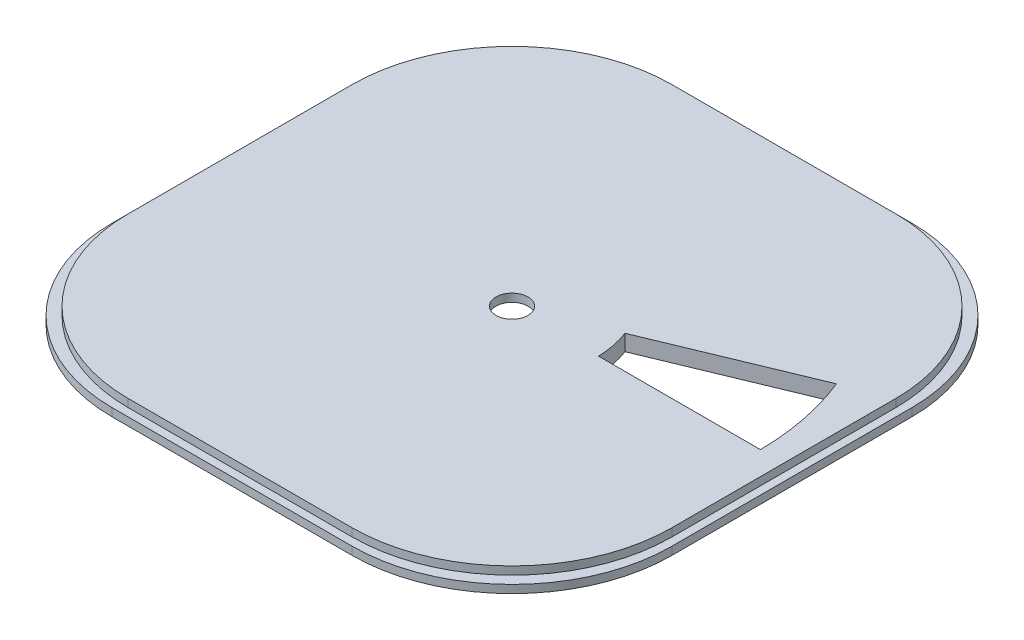
ISO-10303-21;
HEADER;
FILE_DESCRIPTION(('STEP AP214'),'2;1');
FILE_NAME('part.step','',(''),(''),'','','');
FILE_SCHEMA(('AUTOMOTIVE_DESIGN { 1 0 10303 214 1 1 1 1 }'));
ENDSEC;
DATA;
#1=APPLICATION_CONTEXT('core data for automotive mechanical design processes');
#2=APPLICATION_PROTOCOL_DEFINITION('international standard','automotive_design',2000,#1);
#3=PRODUCT_CONTEXT('',#1,'mechanical');
#4=PRODUCT('Part','Part','',(#3));
#5=PRODUCT_RELATED_PRODUCT_CATEGORY('part','',(#4));
#6=PRODUCT_DEFINITION_FORMATION('','',#4);
#7=PRODUCT_DEFINITION_CONTEXT('part definition',#1,'design');
#8=PRODUCT_DEFINITION('design','',#6,#7);
#9=PRODUCT_DEFINITION_SHAPE('','',#8);
#10=(LENGTH_UNIT() NAMED_UNIT(*) SI_UNIT(.MILLI.,.METRE.));
#11=(NAMED_UNIT(*) PLANE_ANGLE_UNIT() SI_UNIT($,.RADIAN.));
#12=(NAMED_UNIT(*) SI_UNIT($,.STERADIAN.) SOLID_ANGLE_UNIT());
#13=UNCERTAINTY_MEASURE_WITH_UNIT(LENGTH_MEASURE(1.E-05),#10,'distance_accuracy_value','');
#14=(GEOMETRIC_REPRESENTATION_CONTEXT(3) GLOBAL_UNCERTAINTY_ASSIGNED_CONTEXT((#13)) GLOBAL_UNIT_ASSIGNED_CONTEXT((#10,
#11,#12)) REPRESENTATION_CONTEXT('',''));
#15=CARTESIAN_POINT('',(0.,0.,0.));
#16=DIRECTION('',(0.,0.,1.));
#17=DIRECTION('',(1.,0.,0.));
#18=AXIS2_PLACEMENT_3D('',#15,#16,#17);
#19=CARTESIAN_POINT('',(-30.,0.,30.));
#20=DIRECTION('',(0.,-1.,0.));
#21=DIRECTION('',(0.,0.,-1.));
#22=AXIS2_PLACEMENT_3D('',#19,#20,#21);
#23=PLANE('',#22);
#24=DIRECTION('',(0.,0.,1.));
#25=VECTOR('',#24,1.);
#26=CARTESIAN_POINT('',(-70.,0.,-29.9999999999997));
#27=LINE('',#26,#25);
#28=CARTESIAN_POINT('',(-70.,0.,-29.9999999999997));
#29=VERTEX_POINT('',#28);
#30=CARTESIAN_POINT('',(-70.,0.,29.9999999999997));
#31=VERTEX_POINT('',#30);
#32=EDGE_CURVE('E324',#29,#31,#27,.T.);
#33=ORIENTED_EDGE('',*,*,#32,.T.);
#34=CARTESIAN_POINT('',(-30.,0.,30.));
#35=DIRECTION('',(0.,-1.,0.));
#36=DIRECTION('',(0.,0.,-1.));
#37=AXIS2_PLACEMENT_3D('',#34,#35,#36);
#38=CIRCLE('',#37,40.);
#39=CARTESIAN_POINT('',(-29.9999999999997,0.,70.));
#40=VERTEX_POINT('',#39);
#41=EDGE_CURVE('E347',#40,#31,#38,.T.);
#42=ORIENTED_EDGE('',*,*,#41,.F.);
#43=DIRECTION('',(1.,0.,0.));
#44=VECTOR('',#43,1.);
#45=CARTESIAN_POINT('',(-29.9999999999997,0.,70.));
#46=LINE('',#45,#44);
#47=CARTESIAN_POINT('',(29.9999999999997,0.,70.));
#48=VERTEX_POINT('',#47);
#49=EDGE_CURVE('E350',#40,#48,#46,.T.);
#50=ORIENTED_EDGE('',*,*,#49,.T.);
#51=CARTESIAN_POINT('',(30.,0.,30.));
#52=DIRECTION('',(0.,1.,0.));
#53=DIRECTION('',(0.,0.,1.));
#54=AXIS2_PLACEMENT_3D('',#51,#52,#53);
#55=CIRCLE('',#54,40.);
#56=CARTESIAN_POINT('',(70.,0.,29.9999999999997));
#57=VERTEX_POINT('',#56);
#58=EDGE_CURVE('E353',#48,#57,#55,.T.);
#59=ORIENTED_EDGE('',*,*,#58,.T.);
#60=DIRECTION('',(0.,0.,1.));
#61=VECTOR('',#60,1.);
#62=CARTESIAN_POINT('',(70.,0.,-29.9999999999997));
#63=LINE('',#62,#61);
#64=CARTESIAN_POINT('',(70.,0.,-29.9999999999997));
#65=VERTEX_POINT('',#64);
#66=EDGE_CURVE('E356',#65,#57,#63,.T.);
#67=ORIENTED_EDGE('',*,*,#66,.F.);
#68=CARTESIAN_POINT('',(30.,0.,-30.));
#69=DIRECTION('',(0.,1.,0.));
#70=DIRECTION('',(0.,0.,1.));
#71=AXIS2_PLACEMENT_3D('',#68,#69,#70);
#72=CIRCLE('',#71,40.);
#73=CARTESIAN_POINT('',(29.9999999999997,0.,-70.));
#74=VERTEX_POINT('',#73);
#75=EDGE_CURVE('E359',#65,#74,#72,.T.);
#76=ORIENTED_EDGE('',*,*,#75,.T.);
#77=DIRECTION('',(1.,0.,0.));
#78=VECTOR('',#77,1.);
#79=CARTESIAN_POINT('',(-29.9999999999997,0.,-70.));
#80=LINE('',#79,#78);
#81=CARTESIAN_POINT('',(-30.,0.,-70.));
#82=VERTEX_POINT('',#81);
#83=EDGE_CURVE('E362',#82,#74,#80,.T.);
#84=ORIENTED_EDGE('',*,*,#83,.F.);
#85=CARTESIAN_POINT('',(-30.,0.,-30.));
#86=DIRECTION('',(0.,-1.,0.));
#87=DIRECTION('',(0.,0.,-1.));
#88=AXIS2_PLACEMENT_3D('',#85,#86,#87);
#89=CIRCLE('',#88,40.);
#90=EDGE_CURVE('E365',#29,#82,#89,.T.);
#91=ORIENTED_EDGE('',*,*,#90,.F.);
#92=EDGE_LOOP('',(#33,#42,#50,#59,#67,#76,#84,#91));
#93=FACE_BOUND('',#92,.T.);
#94=CARTESIAN_POINT('',(-28.,0.,28.));
#95=DIRECTION('',(0.,1.,0.));
#96=DIRECTION('',(0.,0.,1.));
#97=AXIS2_PLACEMENT_3D('',#94,#95,#96);
#98=CIRCLE('',#97,40.);
#99=CARTESIAN_POINT('',(-68.,0.,27.9999999999997));
#100=VERTEX_POINT('',#99);
#101=CARTESIAN_POINT('',(-27.9999999999997,0.,68.));
#102=VERTEX_POINT('',#101);
#103=EDGE_CURVE('E257',#100,#102,#98,.T.);
#104=ORIENTED_EDGE('',*,*,#103,.F.);
#105=DIRECTION('',(0.,0.,1.));
#106=VECTOR('',#105,1.);
#107=CARTESIAN_POINT('',(-68.,0.,-27.9999999999997));
#108=LINE('',#107,#106);
#109=CARTESIAN_POINT('',(-68.,0.,-27.9999999999997));
#110=VERTEX_POINT('',#109);
#111=EDGE_CURVE('E264',#110,#100,#108,.T.);
#112=ORIENTED_EDGE('',*,*,#111,.F.);
#113=CARTESIAN_POINT('',(-28.,0.,-28.));
#114=DIRECTION('',(0.,1.,0.));
#115=DIRECTION('',(0.,0.,-1.));
#116=AXIS2_PLACEMENT_3D('',#113,#114,#115);
#117=CIRCLE('',#116,40.);
#118=CARTESIAN_POINT('',(-28.,0.,-68.));
#119=VERTEX_POINT('',#118);
#120=EDGE_CURVE('E296',#119,#110,#117,.T.);
#121=ORIENTED_EDGE('',*,*,#120,.F.);
#122=DIRECTION('',(-1.,0.,0.));
#123=VECTOR('',#122,1.);
#124=CARTESIAN_POINT('',(-27.9999999999997,0.,-68.));
#125=LINE('',#124,#123);
#126=CARTESIAN_POINT('',(27.9999999999997,0.,-68.));
#127=VERTEX_POINT('',#126);
#128=EDGE_CURVE('E293',#127,#119,#125,.T.);
#129=ORIENTED_EDGE('',*,*,#128,.F.);
#130=CARTESIAN_POINT('',(28.,0.,-28.));
#131=DIRECTION('',(0.,1.,0.));
#132=DIRECTION('',(0.,0.,1.));
#133=AXIS2_PLACEMENT_3D('',#130,#131,#132);
#134=CIRCLE('',#133,40.);
#135=CARTESIAN_POINT('',(68.,0.,-27.9999999999997));
#136=VERTEX_POINT('',#135);
#137=EDGE_CURVE('E290',#136,#127,#134,.T.);
#138=ORIENTED_EDGE('',*,*,#137,.F.);
#139=DIRECTION('',(0.,0.,-1.));
#140=VECTOR('',#139,1.);
#141=CARTESIAN_POINT('',(68.,0.,-27.9999999999997));
#142=LINE('',#141,#140);
#143=CARTESIAN_POINT('',(68.,0.,27.9999999999997));
#144=VERTEX_POINT('',#143);
#145=EDGE_CURVE('E287',#144,#136,#142,.T.);
#146=ORIENTED_EDGE('',*,*,#145,.F.);
#147=CARTESIAN_POINT('',(28.,0.,28.));
#148=DIRECTION('',(0.,1.,0.));
#149=DIRECTION('',(0.,0.,1.));
#150=AXIS2_PLACEMENT_3D('',#147,#148,#149);
#151=CIRCLE('',#150,40.);
#152=CARTESIAN_POINT('',(27.9999999999997,0.,68.));
#153=VERTEX_POINT('',#152);
#154=EDGE_CURVE('E284',#153,#144,#151,.T.);
#155=ORIENTED_EDGE('',*,*,#154,.F.);
#156=DIRECTION('',(1.,0.,0.));
#157=VECTOR('',#156,1.);
#158=CARTESIAN_POINT('',(-27.9999999999997,0.,68.));
#159=LINE('',#158,#157);
#160=EDGE_CURVE('E281',#102,#153,#159,.T.);
#161=ORIENTED_EDGE('',*,*,#160,.F.);
#162=EDGE_LOOP('',(#104,#112,#121,#129,#138,#146,#155,#161));
#163=FACE_BOUND('',#162,.T.);
#164=ADVANCED_FACE('F34',(#93,#163),#23,.F.);
#165=CARTESIAN_POINT('',(-70.,-2.,-29.9999999999997));
#166=DIRECTION('',(-1.,0.,0.));
#167=DIRECTION('',(0.,0.,1.));
#168=AXIS2_PLACEMENT_3D('',#165,#166,#167);
#169=PLANE('',#168);
#170=DIRECTION('',(0.,-1.,0.));
#171=VECTOR('',#170,1.);
#172=CARTESIAN_POINT('',(-70.,-0.999999999999986,3.99999999999999));
#173=LINE('',#172,#171);
#174=CARTESIAN_POINT('',(-70.,-0.999999999999986,3.99999999999999));
#175=VERTEX_POINT('',#174);
#176=CARTESIAN_POINT('',(-70.,-2.,3.99999999999999));
#177=VERTEX_POINT('',#176);
#178=EDGE_CURVE('E237',#175,#177,#173,.T.);
#179=ORIENTED_EDGE('',*,*,#178,.T.);
#180=DIRECTION('',(0.,0.,1.));
#181=VECTOR('',#180,1.);
#182=CARTESIAN_POINT('',(-70.,-2.,-29.9999999999997));
#183=LINE('',#182,#181);
#184=CARTESIAN_POINT('',(-70.,-2.,29.9999999999997));
#185=VERTEX_POINT('',#184);
#186=EDGE_CURVE('E327',#177,#185,#183,.T.);
#187=ORIENTED_EDGE('',*,*,#186,.T.);
#188=DIRECTION('',(0.,1.,0.));
#189=VECTOR('',#188,1.);
#190=CARTESIAN_POINT('',(-70.,-2.,29.9999999999997));
#191=LINE('',#190,#189);
#192=EDGE_CURVE('E38',#185,#31,#191,.T.);
#193=ORIENTED_EDGE('',*,*,#192,.T.);
#194=ORIENTED_EDGE('',*,*,#32,.F.);
#195=DIRECTION('',(0.,1.,0.));
#196=VECTOR('',#195,1.);
#197=CARTESIAN_POINT('',(-70.,-2.,-29.9999999999997));
#198=LINE('',#197,#196);
#199=CARTESIAN_POINT('',(-70.,-2.,-29.9999999999997));
#200=VERTEX_POINT('',#199);
#201=EDGE_CURVE('E11',#200,#29,#198,.T.);
#202=ORIENTED_EDGE('',*,*,#201,.F.);
#203=CARTESIAN_POINT('',(-70.,-2.,-4.00000000000001));
#204=VERTEX_POINT('',#203);
#205=EDGE_CURVE('E215',#200,#204,#183,.T.);
#206=ORIENTED_EDGE('',*,*,#205,.T.);
#207=DIRECTION('',(0.,-1.,0.));
#208=VECTOR('',#207,1.);
#209=CARTESIAN_POINT('',(-70.,-0.999999999999986,-4.00000000000001));
#210=LINE('',#209,#208);
#211=CARTESIAN_POINT('',(-70.,-0.999999999999986,-4.00000000000001));
#212=VERTEX_POINT('',#211);
#213=EDGE_CURVE('E197',#212,#204,#210,.T.);
#214=ORIENTED_EDGE('',*,*,#213,.F.);
#215=DIRECTION('',(0.,0.,-1.));
#216=VECTOR('',#215,1.);
#217=CARTESIAN_POINT('',(-70.,-0.999999999999986,0.));
#218=LINE('',#217,#216);
#219=EDGE_CURVE('E203',#175,#212,#218,.T.);
#220=ORIENTED_EDGE('',*,*,#219,.F.);
#221=EDGE_LOOP('',(#179,#187,#193,#194,#202,#206,#214,#220));
#222=FACE_BOUND('',#221,.T.);
#223=ADVANCED_FACE('F36',(#222),#169,.T.);
#224=CARTESIAN_POINT('',(-30.,-2.,-30.));
#225=DIRECTION('',(0.,1.,0.));
#226=DIRECTION('',(0.,0.,1.));
#227=AXIS2_PLACEMENT_3D('',#224,#225,#226);
#228=CYLINDRICAL_SURFACE('',#227,40.);
#229=ORIENTED_EDGE('',*,*,#90,.T.);
#230=DIRECTION('',(0.,1.,0.));
#231=VECTOR('',#230,1.);
#232=CARTESIAN_POINT('',(-30.,-2.,-70.));
#233=LINE('',#232,#231);
#234=CARTESIAN_POINT('',(-30.,-2.,-70.));
#235=VERTEX_POINT('',#234);
#236=EDGE_CURVE('E43',#235,#82,#233,.T.);
#237=ORIENTED_EDGE('',*,*,#236,.F.);
#238=CARTESIAN_POINT('',(-30.,-2.,-30.));
#239=DIRECTION('',(0.,-1.,0.));
#240=DIRECTION('',(0.,0.,-1.));
#241=AXIS2_PLACEMENT_3D('',#238,#239,#240);
#242=CIRCLE('',#241,40.);
#243=EDGE_CURVE('E343',#200,#235,#242,.T.);
#244=ORIENTED_EDGE('',*,*,#243,.F.);
#245=ORIENTED_EDGE('',*,*,#201,.T.);
#246=EDGE_LOOP('',(#229,#237,#244,#245));
#247=FACE_BOUND('',#246,.T.);
#248=ADVANCED_FACE('F391',(#247),#228,.T.);
#249=CARTESIAN_POINT('',(-29.9999999999997,-2.,-70.));
#250=DIRECTION('',(0.,0.,1.));
#251=DIRECTION('',(1.,0.,0.));
#252=AXIS2_PLACEMENT_3D('',#249,#250,#251);
#253=PLANE('',#252);
#254=ORIENTED_EDGE('',*,*,#83,.T.);
#255=DIRECTION('',(0.,1.,0.));
#256=VECTOR('',#255,1.);
#257=CARTESIAN_POINT('',(29.9999999999997,-2.,-70.));
#258=LINE('',#257,#256);
#259=CARTESIAN_POINT('',(29.9999999999997,-2.,-70.));
#260=VERTEX_POINT('',#259);
#261=EDGE_CURVE('E369',#260,#74,#258,.T.);
#262=ORIENTED_EDGE('',*,*,#261,.F.);
#263=DIRECTION('',(1.,0.,0.));
#264=VECTOR('',#263,1.);
#265=CARTESIAN_POINT('',(-29.9999999999997,-2.,-70.));
#266=LINE('',#265,#264);
#267=EDGE_CURVE('E341',#235,#260,#266,.T.);
#268=ORIENTED_EDGE('',*,*,#267,.F.);
#269=ORIENTED_EDGE('',*,*,#236,.T.);
#270=EDGE_LOOP('',(#254,#262,#268,#269));
#271=FACE_BOUND('',#270,.T.);
#272=ADVANCED_FACE('F395',(#271),#253,.F.);
#273=CARTESIAN_POINT('',(30.,-2.,-30.));
#274=DIRECTION('',(0.,1.,0.));
#275=DIRECTION('',(0.,0.,1.));
#276=AXIS2_PLACEMENT_3D('',#273,#274,#275);
#277=CYLINDRICAL_SURFACE('',#276,40.);
#278=ORIENTED_EDGE('',*,*,#75,.F.);
#279=DIRECTION('',(0.,1.,0.));
#280=VECTOR('',#279,1.);
#281=CARTESIAN_POINT('',(70.,-2.,-29.9999999999997));
#282=LINE('',#281,#280);
#283=CARTESIAN_POINT('',(70.,-2.,-29.9999999999997));
#284=VERTEX_POINT('',#283);
#285=EDGE_CURVE('E371',#284,#65,#282,.T.);
#286=ORIENTED_EDGE('',*,*,#285,.F.);
#287=CARTESIAN_POINT('',(30.,-2.,-30.));
#288=DIRECTION('',(0.,1.,0.));
#289=DIRECTION('',(0.,0.,1.));
#290=AXIS2_PLACEMENT_3D('',#287,#288,#289);
#291=CIRCLE('',#290,40.);
#292=EDGE_CURVE('E338',#284,#260,#291,.T.);
#293=ORIENTED_EDGE('',*,*,#292,.T.);
#294=ORIENTED_EDGE('',*,*,#261,.T.);
#295=EDGE_LOOP('',(#278,#286,#293,#294));
#296=FACE_BOUND('',#295,.T.);
#297=ADVANCED_FACE('F451',(#296),#277,.T.);
#298=CARTESIAN_POINT('',(70.,-2.,-29.9999999999997));
#299=DIRECTION('',(-1.,0.,0.));
#300=DIRECTION('',(0.,0.,1.));
#301=AXIS2_PLACEMENT_3D('',#298,#299,#300);
#302=PLANE('',#301);
#303=ORIENTED_EDGE('',*,*,#66,.T.);
#304=DIRECTION('',(0.,1.,0.));
#305=VECTOR('',#304,1.);
#306=CARTESIAN_POINT('',(70.,-2.,29.9999999999997));
#307=LINE('',#306,#305);
#308=CARTESIAN_POINT('',(70.,-2.,29.9999999999997));
#309=VERTEX_POINT('',#308);
#310=EDGE_CURVE('E373',#309,#57,#307,.T.);
#311=ORIENTED_EDGE('',*,*,#310,.F.);
#312=DIRECTION('',(0.,0.,1.));
#313=VECTOR('',#312,1.);
#314=CARTESIAN_POINT('',(70.,-2.,-29.9999999999997));
#315=LINE('',#314,#313);
#316=EDGE_CURVE('E336',#284,#309,#315,.T.);
#317=ORIENTED_EDGE('',*,*,#316,.F.);
#318=ORIENTED_EDGE('',*,*,#285,.T.);
#319=EDGE_LOOP('',(#303,#311,#317,#318));
#320=FACE_BOUND('',#319,.T.);
#321=ADVANCED_FACE('F454',(#320),#302,.F.);
#322=CARTESIAN_POINT('',(30.,-2.,30.));
#323=DIRECTION('',(0.,1.,0.));
#324=DIRECTION('',(0.,0.,1.));
#325=AXIS2_PLACEMENT_3D('',#322,#323,#324);
#326=CYLINDRICAL_SURFACE('',#325,40.);
#327=ORIENTED_EDGE('',*,*,#58,.F.);
#328=DIRECTION('',(0.,1.,0.));
#329=VECTOR('',#328,1.);
#330=CARTESIAN_POINT('',(29.9999999999997,-2.,70.));
#331=LINE('',#330,#329);
#332=CARTESIAN_POINT('',(29.9999999999997,-2.,70.));
#333=VERTEX_POINT('',#332);
#334=EDGE_CURVE('E375',#333,#48,#331,.T.);
#335=ORIENTED_EDGE('',*,*,#334,.F.);
#336=CARTESIAN_POINT('',(30.,-2.,30.));
#337=DIRECTION('',(0.,1.,0.));
#338=DIRECTION('',(0.,0.,1.));
#339=AXIS2_PLACEMENT_3D('',#336,#337,#338);
#340=CIRCLE('',#339,40.);
#341=EDGE_CURVE('E333',#333,#309,#340,.T.);
#342=ORIENTED_EDGE('',*,*,#341,.T.);
#343=ORIENTED_EDGE('',*,*,#310,.T.);
#344=EDGE_LOOP('',(#327,#335,#342,#343));
#345=FACE_BOUND('',#344,.T.);
#346=ADVANCED_FACE('F458',(#345),#326,.T.);
#347=CARTESIAN_POINT('',(-29.9999999999997,-2.,70.));
#348=DIRECTION('',(0.,0.,1.));
#349=DIRECTION('',(1.,0.,0.));
#350=AXIS2_PLACEMENT_3D('',#347,#348,#349);
#351=PLANE('',#350);
#352=ORIENTED_EDGE('',*,*,#49,.F.);
#353=DIRECTION('',(0.,1.,0.));
#354=VECTOR('',#353,1.);
#355=CARTESIAN_POINT('',(-29.9999999999997,-2.,70.));
#356=LINE('',#355,#354);
#357=CARTESIAN_POINT('',(-29.9999999999997,-2.,70.));
#358=VERTEX_POINT('',#357);
#359=EDGE_CURVE('E376',#358,#40,#356,.T.);
#360=ORIENTED_EDGE('',*,*,#359,.F.);
#361=DIRECTION('',(1.,0.,0.));
#362=VECTOR('',#361,1.);
#363=CARTESIAN_POINT('',(-29.9999999999997,-2.,70.));
#364=LINE('',#363,#362);
#365=EDGE_CURVE('E330',#358,#333,#364,.T.);
#366=ORIENTED_EDGE('',*,*,#365,.T.);
#367=ORIENTED_EDGE('',*,*,#334,.T.);
#368=EDGE_LOOP('',(#352,#360,#366,#367));
#369=FACE_BOUND('',#368,.T.);
#370=ADVANCED_FACE('F462',(#369),#351,.T.);
#371=CARTESIAN_POINT('',(-30.,-2.,30.));
#372=DIRECTION('',(0.,1.,0.));
#373=DIRECTION('',(0.,0.,1.));
#374=AXIS2_PLACEMENT_3D('',#371,#372,#373);
#375=CYLINDRICAL_SURFACE('',#374,40.);
#376=ORIENTED_EDGE('',*,*,#41,.T.);
#377=ORIENTED_EDGE('',*,*,#192,.F.);
#378=CARTESIAN_POINT('',(-30.,-2.,30.));
#379=DIRECTION('',(0.,-1.,0.));
#380=DIRECTION('',(0.,0.,-1.));
#381=AXIS2_PLACEMENT_3D('',#378,#379,#380);
#382=CIRCLE('',#381,40.);
#383=EDGE_CURVE('E326',#358,#185,#382,.T.);
#384=ORIENTED_EDGE('',*,*,#383,.F.);
#385=ORIENTED_EDGE('',*,*,#359,.T.);
#386=EDGE_LOOP('',(#376,#377,#384,#385));
#387=FACE_BOUND('',#386,.T.);
#388=ADVANCED_FACE('F383',(#387),#375,.T.);
#389=CARTESIAN_POINT('',(-30.,-2.,30.));
#390=DIRECTION('',(0.,-1.,0.));
#391=DIRECTION('',(0.,0.,-1.));
#392=AXIS2_PLACEMENT_3D('',#389,#390,#391);
#393=PLANE('',#392);
#394=DIRECTION('',(-1.,0.,0.));
#395=VECTOR('',#394,1.);
#396=CARTESIAN_POINT('',(-70.,-2.,3.99999999999999));
#397=LINE('',#396,#395);
#398=CARTESIAN_POINT('',(-10.2469507659596,-2.,3.99999999999999));
#399=VERTEX_POINT('',#398);
#400=EDGE_CURVE('E211',#399,#177,#397,.T.);
#401=ORIENTED_EDGE('',*,*,#400,.F.);
#402=CARTESIAN_POINT('',(0.,-2.,0.));
#403=DIRECTION('',(0.,-1.,0.));
#404=DIRECTION('',(0.,0.,-1.));
#405=AXIS2_PLACEMENT_3D('',#402,#403,#404);
#406=CIRCLE('',#405,11.);
#407=CARTESIAN_POINT('',(-10.2469507659596,-2.,-4.00000000000001));
#408=VERTEX_POINT('',#407);
#409=EDGE_CURVE('E247',#408,#399,#406,.T.);
#410=ORIENTED_EDGE('',*,*,#409,.F.);
#411=DIRECTION('',(1.,0.,0.));
#412=VECTOR('',#411,1.);
#413=CARTESIAN_POINT('',(-70.,-2.,-4.00000000000001));
#414=LINE('',#413,#412);
#415=EDGE_CURVE('E403',#204,#408,#414,.T.);
#416=ORIENTED_EDGE('',*,*,#415,.F.);
#417=ORIENTED_EDGE('',*,*,#205,.F.);
#418=ORIENTED_EDGE('',*,*,#243,.T.);
#419=ORIENTED_EDGE('',*,*,#267,.T.);
#420=ORIENTED_EDGE('',*,*,#292,.F.);
#421=ORIENTED_EDGE('',*,*,#316,.T.);
#422=ORIENTED_EDGE('',*,*,#341,.F.);
#423=ORIENTED_EDGE('',*,*,#365,.F.);
#424=ORIENTED_EDGE('',*,*,#383,.T.);
#425=ORIENTED_EDGE('',*,*,#186,.F.);
#426=EDGE_LOOP('',(#401,#410,#416,#417,#418,#419,#420,#421,#422,#423,#424,#425));
#427=FACE_BOUND('',#426,.T.);
#428=CARTESIAN_POINT('',(-3.34383897184799,-2.,0.67943395435353));
#429=DIRECTION('',(0.,-1.,0.));
#430=DIRECTION('',(0.,0.,1.));
#431=AXIS2_PLACEMENT_3D('',#428,#429,#430);
#432=CIRCLE('',#431,25.);
#433=CARTESIAN_POINT('',(20.0028952371791,-2.,-8.2609240794752));
#434=VERTEX_POINT('',#433);
#435=CARTESIAN_POINT('',(21.6470578138116,-2.,0.00483937350486546));
#436=VERTEX_POINT('',#435);
#437=EDGE_CURVE('E222',#434,#436,#432,.T.);
#438=ORIENTED_EDGE('',*,*,#437,.T.);
#439=DIRECTION('',(1.,0.,0.));
#440=VECTOR('',#439,1.);
#441=CARTESIAN_POINT('',(21.6470578138116,-2.,0.00483937350486546));
#442=LINE('',#441,#440);
#443=CARTESIAN_POINT('',(62.1526870593202,-2.,0.00483937350486546));
#444=VERTEX_POINT('',#443);
#445=EDGE_CURVE('E225',#436,#444,#442,.T.);
#446=ORIENTED_EDGE('',*,*,#445,.T.);
#447=CARTESIAN_POINT('',(-3.34383897184799,-2.,0.67943395435353));
#448=DIRECTION('',(0.,1.,0.));
#449=DIRECTION('',(0.,0.,1.));
#450=AXIS2_PLACEMENT_3D('',#447,#448,#449);
#451=CIRCLE('',#450,65.5);
#452=CARTESIAN_POINT('',(57.4252170485951,-2.,-23.7617573092542));
#453=VERTEX_POINT('',#452);
#454=EDGE_CURVE('E59',#444,#453,#451,.T.);
#455=ORIENTED_EDGE('',*,*,#454,.T.);
#456=DIRECTION('',(-0.923879532511287,0.,0.38268343236509));
#457=VECTOR('',#456,1.);
#458=CARTESIAN_POINT('',(20.0028952371791,-2.,-8.2609240794752));
#459=LINE('',#458,#457);
#460=EDGE_CURVE('E230',#453,#434,#459,.T.);
#461=ORIENTED_EDGE('',*,*,#460,.T.);
#462=EDGE_LOOP('',(#438,#446,#455,#461));
#463=FACE_BOUND('',#462,.T.);
#464=ADVANCED_FACE('F400',(#427,#463),#393,.T.);
#465=CARTESIAN_POINT('',(-28.,2.,28.));
#466=DIRECTION('',(0.,-1.,0.));
#467=DIRECTION('',(0.,0.,-1.));
#468=AXIS2_PLACEMENT_3D('',#465,#466,#467);
#469=CYLINDRICAL_SURFACE('',#468,40.);
#470=ORIENTED_EDGE('',*,*,#103,.T.);
#471=DIRECTION('',(0.,-1.,0.));
#472=VECTOR('',#471,1.);
#473=CARTESIAN_POINT('',(-27.9999999999997,2.,68.));
#474=LINE('',#473,#472);
#475=CARTESIAN_POINT('',(-27.9999999999997,2.,68.));
#476=VERTEX_POINT('',#475);
#477=EDGE_CURVE('E321',#476,#102,#474,.T.);
#478=ORIENTED_EDGE('',*,*,#477,.F.);
#479=CARTESIAN_POINT('',(-28.,2.,28.));
#480=DIRECTION('',(0.,1.,0.));
#481=DIRECTION('',(0.,0.,1.));
#482=AXIS2_PLACEMENT_3D('',#479,#480,#481);
#483=CIRCLE('',#482,40.);
#484=CARTESIAN_POINT('',(-68.,2.,27.9999999999997));
#485=VERTEX_POINT('',#484);
#486=EDGE_CURVE('E260',#485,#476,#483,.T.);
#487=ORIENTED_EDGE('',*,*,#486,.F.);
#488=DIRECTION('',(0.,-1.,0.));
#489=VECTOR('',#488,1.);
#490=CARTESIAN_POINT('',(-68.,2.,27.9999999999997));
#491=LINE('',#490,#489);
#492=EDGE_CURVE('E278',#485,#100,#491,.T.);
#493=ORIENTED_EDGE('',*,*,#492,.T.);
#494=EDGE_LOOP('',(#470,#478,#487,#493));
#495=FACE_BOUND('',#494,.T.);
#496=ADVANCED_FACE('F470',(#495),#469,.T.);
#497=CARTESIAN_POINT('',(-27.9999999999997,2.,68.));
#498=DIRECTION('',(0.,0.,-1.));
#499=DIRECTION('',(-1.,0.,0.));
#500=AXIS2_PLACEMENT_3D('',#497,#498,#499);
#501=PLANE('',#500);
#502=ORIENTED_EDGE('',*,*,#160,.T.);
#503=DIRECTION('',(0.,-1.,0.));
#504=VECTOR('',#503,1.);
#505=CARTESIAN_POINT('',(27.9999999999997,2.,68.));
#506=LINE('',#505,#504);
#507=CARTESIAN_POINT('',(27.9999999999997,2.,68.));
#508=VERTEX_POINT('',#507);
#509=EDGE_CURVE('E318',#508,#153,#506,.T.);
#510=ORIENTED_EDGE('',*,*,#509,.F.);
#511=DIRECTION('',(1.,0.,0.));
#512=VECTOR('',#511,1.);
#513=CARTESIAN_POINT('',(-27.9999999999997,2.,68.));
#514=LINE('',#513,#512);
#515=EDGE_CURVE('E263',#476,#508,#514,.T.);
#516=ORIENTED_EDGE('',*,*,#515,.F.);
#517=ORIENTED_EDGE('',*,*,#477,.T.);
#518=EDGE_LOOP('',(#502,#510,#516,#517));
#519=FACE_BOUND('',#518,.T.);
#520=ADVANCED_FACE('F474',(#519),#501,.F.);
#521=CARTESIAN_POINT('',(28.,2.,28.));
#522=DIRECTION('',(0.,-1.,0.));
#523=DIRECTION('',(0.,0.,-1.));
#524=AXIS2_PLACEMENT_3D('',#521,#522,#523);
#525=CYLINDRICAL_SURFACE('',#524,40.);
#526=ORIENTED_EDGE('',*,*,#154,.T.);
#527=DIRECTION('',(0.,-1.,0.));
#528=VECTOR('',#527,1.);
#529=CARTESIAN_POINT('',(68.,2.,27.9999999999997));
#530=LINE('',#529,#528);
#531=CARTESIAN_POINT('',(68.,2.,27.9999999999997));
#532=VERTEX_POINT('',#531);
#533=EDGE_CURVE('E315',#532,#144,#530,.T.);
#534=ORIENTED_EDGE('',*,*,#533,.F.);
#535=CARTESIAN_POINT('',(28.,2.,28.));
#536=DIRECTION('',(0.,1.,0.));
#537=DIRECTION('',(0.,0.,1.));
#538=AXIS2_PLACEMENT_3D('',#535,#536,#537);
#539=CIRCLE('',#538,40.);
#540=EDGE_CURVE('E266',#508,#532,#539,.T.);
#541=ORIENTED_EDGE('',*,*,#540,.F.);
#542=ORIENTED_EDGE('',*,*,#509,.T.);
#543=EDGE_LOOP('',(#526,#534,#541,#542));
#544=FACE_BOUND('',#543,.T.);
#545=ADVANCED_FACE('F479',(#544),#525,.T.);
#546=CARTESIAN_POINT('',(68.,2.,-27.9999999999997));
#547=DIRECTION('',(-1.,0.,0.));
#548=DIRECTION('',(0.,0.,1.));
#549=AXIS2_PLACEMENT_3D('',#546,#547,#548);
#550=PLANE('',#549);
#551=ORIENTED_EDGE('',*,*,#145,.T.);
#552=DIRECTION('',(0.,-1.,0.));
#553=VECTOR('',#552,1.);
#554=CARTESIAN_POINT('',(68.,2.,-27.9999999999997));
#555=LINE('',#554,#553);
#556=CARTESIAN_POINT('',(68.,2.,-27.9999999999997));
#557=VERTEX_POINT('',#556);
#558=EDGE_CURVE('E312',#557,#136,#555,.T.);
#559=ORIENTED_EDGE('',*,*,#558,.F.);
#560=DIRECTION('',(0.,0.,-1.));
#561=VECTOR('',#560,1.);
#562=CARTESIAN_POINT('',(68.,2.,-27.9999999999997));
#563=LINE('',#562,#561);
#564=EDGE_CURVE('E268',#532,#557,#563,.T.);
#565=ORIENTED_EDGE('',*,*,#564,.F.);
#566=ORIENTED_EDGE('',*,*,#533,.T.);
#567=EDGE_LOOP('',(#551,#559,#565,#566));
#568=FACE_BOUND('',#567,.T.);
#569=ADVANCED_FACE('F485',(#568),#550,.F.);
#570=CARTESIAN_POINT('',(28.,2.,-28.));
#571=DIRECTION('',(0.,-1.,0.));
#572=DIRECTION('',(0.,0.,-1.));
#573=AXIS2_PLACEMENT_3D('',#570,#571,#572);
#574=CYLINDRICAL_SURFACE('',#573,40.);
#575=ORIENTED_EDGE('',*,*,#137,.T.);
#576=DIRECTION('',(0.,-1.,0.));
#577=VECTOR('',#576,1.);
#578=CARTESIAN_POINT('',(27.9999999999997,2.,-68.));
#579=LINE('',#578,#577);
#580=CARTESIAN_POINT('',(27.9999999999997,2.,-68.));
#581=VERTEX_POINT('',#580);
#582=EDGE_CURVE('E309',#581,#127,#579,.T.);
#583=ORIENTED_EDGE('',*,*,#582,.F.);
#584=CARTESIAN_POINT('',(28.,2.,-28.));
#585=DIRECTION('',(0.,1.,0.));
#586=DIRECTION('',(0.,0.,1.));
#587=AXIS2_PLACEMENT_3D('',#584,#585,#586);
#588=CIRCLE('',#587,40.);
#589=EDGE_CURVE('E270',#557,#581,#588,.T.);
#590=ORIENTED_EDGE('',*,*,#589,.F.);
#591=ORIENTED_EDGE('',*,*,#558,.T.);
#592=EDGE_LOOP('',(#575,#583,#590,#591));
#593=FACE_BOUND('',#592,.T.);
#594=ADVANCED_FACE('F489',(#593),#574,.T.);
#595=CARTESIAN_POINT('',(-27.9999999999997,2.,-68.));
#596=DIRECTION('',(0.,0.,1.));
#597=DIRECTION('',(1.,0.,0.));
#598=AXIS2_PLACEMENT_3D('',#595,#596,#597);
#599=PLANE('',#598);
#600=ORIENTED_EDGE('',*,*,#128,.T.);
#601=DIRECTION('',(0.,-1.,0.));
#602=VECTOR('',#601,1.);
#603=CARTESIAN_POINT('',(-28.,2.,-68.));
#604=LINE('',#603,#602);
#605=CARTESIAN_POINT('',(-28.,2.,-68.));
#606=VERTEX_POINT('',#605);
#607=EDGE_CURVE('E306',#606,#119,#604,.T.);
#608=ORIENTED_EDGE('',*,*,#607,.F.);
#609=DIRECTION('',(-1.,0.,0.));
#610=VECTOR('',#609,1.);
#611=CARTESIAN_POINT('',(-27.9999999999997,2.,-68.));
#612=LINE('',#611,#610);
#613=EDGE_CURVE('E272',#581,#606,#612,.T.);
#614=ORIENTED_EDGE('',*,*,#613,.F.);
#615=ORIENTED_EDGE('',*,*,#582,.T.);
#616=EDGE_LOOP('',(#600,#608,#614,#615));
#617=FACE_BOUND('',#616,.T.);
#618=ADVANCED_FACE('F493',(#617),#599,.F.);
#619=CARTESIAN_POINT('',(-28.,2.,-28.));
#620=DIRECTION('',(0.,-1.,0.));
#621=DIRECTION('',(0.,0.,-1.));
#622=AXIS2_PLACEMENT_3D('',#619,#620,#621);
#623=CYLINDRICAL_SURFACE('',#622,40.);
#624=ORIENTED_EDGE('',*,*,#120,.T.);
#625=DIRECTION('',(0.,-1.,0.));
#626=VECTOR('',#625,1.);
#627=CARTESIAN_POINT('',(-68.,2.,-27.9999999999997));
#628=LINE('',#627,#626);
#629=CARTESIAN_POINT('',(-68.,2.,-27.9999999999997));
#630=VERTEX_POINT('',#629);
#631=EDGE_CURVE('E303',#630,#110,#628,.T.);
#632=ORIENTED_EDGE('',*,*,#631,.F.);
#633=CARTESIAN_POINT('',(-28.,2.,-28.));
#634=DIRECTION('',(0.,1.,0.));
#635=DIRECTION('',(0.,0.,-1.));
#636=AXIS2_PLACEMENT_3D('',#633,#634,#635);
#637=CIRCLE('',#636,40.);
#638=EDGE_CURVE('E274',#606,#630,#637,.T.);
#639=ORIENTED_EDGE('',*,*,#638,.F.);
#640=ORIENTED_EDGE('',*,*,#607,.T.);
#641=EDGE_LOOP('',(#624,#632,#639,#640));
#642=FACE_BOUND('',#641,.T.);
#643=ADVANCED_FACE('F497',(#642),#623,.T.);
#644=CARTESIAN_POINT('',(-68.,2.,-27.9999999999997));
#645=DIRECTION('',(1.,0.,0.));
#646=DIRECTION('',(0.,0.,-1.));
#647=AXIS2_PLACEMENT_3D('',#644,#645,#646);
#648=PLANE('',#647);
#649=ORIENTED_EDGE('',*,*,#111,.T.);
#650=ORIENTED_EDGE('',*,*,#492,.F.);
#651=DIRECTION('',(0.,0.,1.));
#652=VECTOR('',#651,1.);
#653=CARTESIAN_POINT('',(-68.,2.,-27.9999999999997));
#654=LINE('',#653,#652);
#655=EDGE_CURVE('E276',#630,#485,#654,.T.);
#656=ORIENTED_EDGE('',*,*,#655,.F.);
#657=ORIENTED_EDGE('',*,*,#631,.T.);
#658=EDGE_LOOP('',(#649,#650,#656,#657));
#659=FACE_BOUND('',#658,.T.);
#660=ADVANCED_FACE('F436',(#659),#648,.F.);
#661=CARTESIAN_POINT('',(-28.,2.,28.));
#662=DIRECTION('',(0.,1.,0.));
#663=DIRECTION('',(0.,0.,1.));
#664=AXIS2_PLACEMENT_3D('',#661,#662,#663);
#665=PLANE('',#664);
#666=CARTESIAN_POINT('',(0.,2.,0.));
#667=DIRECTION('',(0.,1.,0.));
#668=DIRECTION('',(0.,0.,1.));
#669=AXIS2_PLACEMENT_3D('',#666,#667,#668);
#670=CIRCLE('',#669,4.);
#671=CARTESIAN_POINT('',(0.,2.,4.));
#672=VERTEX_POINT('',#671);
#673=EDGE_CURVE('E404',#672,#672,#670,.T.);
#674=ORIENTED_EDGE('',*,*,#673,.F.);
#675=EDGE_LOOP('',(#674));
#676=FACE_BOUND('',#675,.T.);
#677=CARTESIAN_POINT('',(-3.34383897184799,2.,0.67943395435353));
#678=DIRECTION('',(0.,-1.,0.));
#679=DIRECTION('',(0.,0.,1.));
#680=AXIS2_PLACEMENT_3D('',#677,#678,#679);
#681=CIRCLE('',#680,25.);
#682=CARTESIAN_POINT('',(20.0028952371791,2.,-8.2609240794752));
#683=VERTEX_POINT('',#682);
#684=CARTESIAN_POINT('',(21.6470578138116,2.,0.00483937350486546));
#685=VERTEX_POINT('',#684);
#686=EDGE_CURVE('E234',#683,#685,#681,.T.);
#687=ORIENTED_EDGE('',*,*,#686,.F.);
#688=DIRECTION('',(-0.923879532511287,0.,0.38268343236509));
#689=VECTOR('',#688,1.);
#690=CARTESIAN_POINT('',(20.0028952371791,2.,-8.2609240794752));
#691=LINE('',#690,#689);
#692=CARTESIAN_POINT('',(57.4252170485951,2.,-23.7617573092542));
#693=VERTEX_POINT('',#692);
#694=EDGE_CURVE('E226',#693,#683,#691,.T.);
#695=ORIENTED_EDGE('',*,*,#694,.F.);
#696=CARTESIAN_POINT('',(-3.34383897184799,2.,0.67943395435353));
#697=DIRECTION('',(0.,1.,0.));
#698=DIRECTION('',(0.,0.,1.));
#699=AXIS2_PLACEMENT_3D('',#696,#697,#698);
#700=CIRCLE('',#699,65.5);
#701=CARTESIAN_POINT('',(62.1526870593202,2.,0.00483937350485939));
#702=VERTEX_POINT('',#701);
#703=EDGE_CURVE('E240',#702,#693,#700,.T.);
#704=ORIENTED_EDGE('',*,*,#703,.F.);
#705=DIRECTION('',(1.,0.,0.));
#706=VECTOR('',#705,1.);
#707=CARTESIAN_POINT('',(21.6470578138116,2.,0.00483937350486546));
#708=LINE('',#707,#706);
#709=EDGE_CURVE('E236',#685,#702,#708,.T.);
#710=ORIENTED_EDGE('',*,*,#709,.F.);
#711=EDGE_LOOP('',(#687,#695,#704,#710));
#712=FACE_BOUND('',#711,.T.);
#713=ORIENTED_EDGE('',*,*,#486,.T.);
#714=ORIENTED_EDGE('',*,*,#515,.T.);
#715=ORIENTED_EDGE('',*,*,#540,.T.);
#716=ORIENTED_EDGE('',*,*,#564,.T.);
#717=ORIENTED_EDGE('',*,*,#589,.T.);
#718=ORIENTED_EDGE('',*,*,#613,.T.);
#719=ORIENTED_EDGE('',*,*,#638,.T.);
#720=ORIENTED_EDGE('',*,*,#655,.T.);
#721=EDGE_LOOP('',(#713,#714,#715,#716,#717,#718,#719,#720));
#722=FACE_BOUND('',#721,.T.);
#723=ADVANCED_FACE('F431',(#676,#712,#722),#665,.T.);
#724=CARTESIAN_POINT('',(0.,0.,0.));
#725=DIRECTION('',(0.,-1.,0.));
#726=DIRECTION('',(0.,0.,-1.));
#727=AXIS2_PLACEMENT_3D('',#724,#725,#726);
#728=CYLINDRICAL_SURFACE('',#727,11.);
#729=ORIENTED_EDGE('',*,*,#409,.T.);
#730=DIRECTION('',(0.,-1.,0.));
#731=VECTOR('',#730,1.);
#732=CARTESIAN_POINT('',(-10.2469507659596,-0.999999999999986,3.99999999999999));
#733=LINE('',#732,#731);
#734=CARTESIAN_POINT('',(-10.2469507659596,-0.999999999999986,3.99999999999999));
#735=VERTEX_POINT('',#734);
#736=EDGE_CURVE('E217',#735,#399,#733,.T.);
#737=ORIENTED_EDGE('',*,*,#736,.F.);
#738=CARTESIAN_POINT('',(0.,-0.999999999999986,0.));
#739=DIRECTION('',(0.,1.,0.));
#740=DIRECTION('',(0.,0.,-1.));
#741=AXIS2_PLACEMENT_3D('',#738,#739,#740);
#742=CIRCLE('',#741,11.);
#743=CARTESIAN_POINT('',(-10.2469507659596,-0.999999999999986,-4.00000000000001));
#744=VERTEX_POINT('',#743);
#745=EDGE_CURVE('E202',#744,#735,#742,.T.);
#746=ORIENTED_EDGE('',*,*,#745,.F.);
#747=DIRECTION('',(0.,-1.,0.));
#748=VECTOR('',#747,1.);
#749=CARTESIAN_POINT('',(-10.2469507659596,-0.999999999999986,-4.00000000000001));
#750=LINE('',#749,#748);
#751=EDGE_CURVE('E200',#744,#408,#750,.T.);
#752=ORIENTED_EDGE('',*,*,#751,.T.);
#753=EDGE_LOOP('',(#729,#737,#746,#752));
#754=FACE_BOUND('',#753,.T.);
#755=CARTESIAN_POINT('',(0.,0.,0.));
#756=DIRECTION('',(0.,-1.,0.));
#757=DIRECTION('',(0.,0.,-1.));
#758=AXIS2_PLACEMENT_3D('',#755,#756,#757);
#759=CIRCLE('',#758,11.);
#760=CARTESIAN_POINT('',(0.,0.,-11.));
#761=VERTEX_POINT('',#760);
#762=EDGE_CURVE('E254',#761,#761,#759,.T.);
#763=ORIENTED_EDGE('',*,*,#762,.F.);
#764=EDGE_LOOP('',(#763));
#765=FACE_BOUND('',#764,.T.);
#766=ADVANCED_FACE('F416',(#754,#765),#728,.F.);
#767=CARTESIAN_POINT('',(0.,0.,0.));
#768=DIRECTION('',(0.,-1.,0.));
#769=DIRECTION('',(0.,0.,-1.));
#770=AXIS2_PLACEMENT_3D('',#767,#768,#769);
#771=PLANE('',#770);
#772=CARTESIAN_POINT('',(0.,0.,0.));
#773=DIRECTION('',(0.,-1.,0.));
#774=DIRECTION('',(0.,0.,-1.));
#775=AXIS2_PLACEMENT_3D('',#772,#773,#774);
#776=CIRCLE('',#775,4.);
#777=CARTESIAN_POINT('',(0.,0.,-4.));
#778=VERTEX_POINT('',#777);
#779=EDGE_CURVE('E408',#778,#778,#776,.T.);
#780=ORIENTED_EDGE('',*,*,#779,.F.);
#781=EDGE_LOOP('',(#780));
#782=FACE_BOUND('',#781,.T.);
#783=ORIENTED_EDGE('',*,*,#762,.T.);
#784=EDGE_LOOP('',(#783));
#785=FACE_BOUND('',#784,.T.);
#786=ADVANCED_FACE('F424',(#782,#785),#771,.T.);
#787=CARTESIAN_POINT('',(-3.34383897184799,-2.,0.67943395435353));
#788=DIRECTION('',(0.,1.,0.));
#789=DIRECTION('',(0.,0.,1.));
#790=AXIS2_PLACEMENT_3D('',#787,#788,#789);
#791=CYLINDRICAL_SURFACE('',#790,25.);
#792=ORIENTED_EDGE('',*,*,#686,.T.);
#793=DIRECTION('',(0.,1.,0.));
#794=VECTOR('',#793,1.);
#795=CARTESIAN_POINT('',(21.6470578138116,-2.,0.00483937350486546));
#796=LINE('',#795,#794);
#797=EDGE_CURVE('E233',#436,#685,#796,.T.);
#798=ORIENTED_EDGE('',*,*,#797,.F.);
#799=ORIENTED_EDGE('',*,*,#437,.F.);
#800=DIRECTION('',(0.,1.,0.));
#801=VECTOR('',#800,1.);
#802=CARTESIAN_POINT('',(20.0028952371791,-2.,-8.2609240794752));
#803=LINE('',#802,#801);
#804=EDGE_CURVE('E245',#434,#683,#803,.T.);
#805=ORIENTED_EDGE('',*,*,#804,.T.);
#806=EDGE_LOOP('',(#792,#798,#799,#805));
#807=FACE_BOUND('',#806,.T.);
#808=ADVANCED_FACE('F427',(#807),#791,.T.);
#809=CARTESIAN_POINT('',(20.0028952371791,-2.,-8.2609240794752));
#810=DIRECTION('',(-0.38268343236509,0.,-0.923879532511287));
#811=DIRECTION('',(-0.923879532511287,0.,0.38268343236509));
#812=AXIS2_PLACEMENT_3D('',#809,#810,#811);
#813=PLANE('',#812);
#814=ORIENTED_EDGE('',*,*,#694,.T.);
#815=ORIENTED_EDGE('',*,*,#804,.F.);
#816=ORIENTED_EDGE('',*,*,#460,.F.);
#817=DIRECTION('',(0.,1.,0.));
#818=VECTOR('',#817,1.);
#819=CARTESIAN_POINT('',(57.4252170485951,-2.,-23.7617573092542));
#820=LINE('',#819,#818);
#821=EDGE_CURVE('E248',#453,#693,#820,.T.);
#822=ORIENTED_EDGE('',*,*,#821,.T.);
#823=EDGE_LOOP('',(#814,#815,#816,#822));
#824=FACE_BOUND('',#823,.T.);
#825=ADVANCED_FACE('F583',(#824),#813,.F.);
#826=CARTESIAN_POINT('',(-3.34383897184799,-2.,0.67943395435353));
#827=DIRECTION('',(0.,1.,0.));
#828=DIRECTION('',(0.,0.,1.));
#829=AXIS2_PLACEMENT_3D('',#826,#827,#828);
#830=CYLINDRICAL_SURFACE('',#829,65.5);
#831=ORIENTED_EDGE('',*,*,#703,.T.);
#832=ORIENTED_EDGE('',*,*,#821,.F.);
#833=ORIENTED_EDGE('',*,*,#454,.F.);
#834=DIRECTION('',(0.,1.,0.));
#835=VECTOR('',#834,1.);
#836=CARTESIAN_POINT('',(62.1526870593202,-2.,0.00483937350485939));
#837=LINE('',#836,#835);
#838=EDGE_CURVE('E250',#444,#702,#837,.T.);
#839=ORIENTED_EDGE('',*,*,#838,.T.);
#840=EDGE_LOOP('',(#831,#832,#833,#839));
#841=FACE_BOUND('',#840,.T.);
#842=ADVANCED_FACE('F574',(#841),#830,.F.);
#843=CARTESIAN_POINT('',(21.6470578138116,-2.,0.00483937350486546));
#844=DIRECTION('',(0.,0.,1.));
#845=DIRECTION('',(1.,0.,0.));
#846=AXIS2_PLACEMENT_3D('',#843,#844,#845);
#847=PLANE('',#846);
#848=ORIENTED_EDGE('',*,*,#709,.T.);
#849=ORIENTED_EDGE('',*,*,#838,.F.);
#850=ORIENTED_EDGE('',*,*,#445,.F.);
#851=ORIENTED_EDGE('',*,*,#797,.T.);
#852=EDGE_LOOP('',(#848,#849,#850,#851));
#853=FACE_BOUND('',#852,.T.);
#854=ADVANCED_FACE('F567',(#853),#847,.F.);
#855=CARTESIAN_POINT('',(-70.,-0.999999999999986,3.99999999999999));
#856=DIRECTION('',(0.,0.,1.));
#857=DIRECTION('',(1.,0.,0.));
#858=AXIS2_PLACEMENT_3D('',#855,#856,#857);
#859=PLANE('',#858);
#860=ORIENTED_EDGE('',*,*,#400,.T.);
#861=ORIENTED_EDGE('',*,*,#178,.F.);
#862=DIRECTION('',(-1.,0.,0.));
#863=VECTOR('',#862,1.);
#864=CARTESIAN_POINT('',(-70.,-0.999999999999986,3.99999999999999));
#865=LINE('',#864,#863);
#866=EDGE_CURVE('E208',#735,#175,#865,.T.);
#867=ORIENTED_EDGE('',*,*,#866,.F.);
#868=ORIENTED_EDGE('',*,*,#736,.T.);
#869=EDGE_LOOP('',(#860,#861,#867,#868));
#870=FACE_BOUND('',#869,.T.);
#871=ADVANCED_FACE('F414',(#870),#859,.F.);
#872=CARTESIAN_POINT('',(-70.,-0.999999999999986,-4.00000000000001));
#873=DIRECTION('',(0.,0.,-1.));
#874=DIRECTION('',(-1.,0.,0.));
#875=AXIS2_PLACEMENT_3D('',#872,#873,#874);
#876=PLANE('',#875);
#877=ORIENTED_EDGE('',*,*,#415,.T.);
#878=ORIENTED_EDGE('',*,*,#751,.F.);
#879=DIRECTION('',(1.,0.,0.));
#880=VECTOR('',#879,1.);
#881=CARTESIAN_POINT('',(-70.,-0.999999999999986,-4.00000000000001));
#882=LINE('',#881,#880);
#883=EDGE_CURVE('E51',#212,#744,#882,.T.);
#884=ORIENTED_EDGE('',*,*,#883,.F.);
#885=ORIENTED_EDGE('',*,*,#213,.T.);
#886=EDGE_LOOP('',(#877,#878,#884,#885));
#887=FACE_BOUND('',#886,.T.);
#888=ADVANCED_FACE('F195',(#887),#876,.F.);
#889=CARTESIAN_POINT('',(0.,-0.999999999999986,0.));
#890=DIRECTION('',(0.,-1.,0.));
#891=DIRECTION('',(0.,0.,-1.));
#892=AXIS2_PLACEMENT_3D('',#889,#890,#891);
#893=PLANE('',#892);
#894=ORIENTED_EDGE('',*,*,#219,.T.);
#895=ORIENTED_EDGE('',*,*,#883,.T.);
#896=ORIENTED_EDGE('',*,*,#745,.T.);
#897=ORIENTED_EDGE('',*,*,#866,.T.);
#898=EDGE_LOOP('',(#894,#895,#896,#897));
#899=FACE_BOUND('',#898,.T.);
#900=ADVANCED_FACE('F207',(#899),#893,.T.);
#901=CARTESIAN_POINT('',(0.,10.,0.));
#902=DIRECTION('',(0.,-1.,0.));
#903=DIRECTION('',(0.,0.,-1.));
#904=AXIS2_PLACEMENT_3D('',#901,#902,#903);
#905=CYLINDRICAL_SURFACE('',#904,4.);
#906=ORIENTED_EDGE('',*,*,#673,.T.);
#907=EDGE_LOOP('',(#906));
#908=FACE_BOUND('',#907,.T.);
#909=ORIENTED_EDGE('',*,*,#779,.T.);
#910=EDGE_LOOP('',(#909));
#911=FACE_BOUND('',#910,.T.);
#912=ADVANCED_FACE('F422',(#908,#911),#905,.F.);
#913=CLOSED_SHELL('',(#164,#223,#248,#272,#297,#321,#346,#370,#388,#464,#496,#520,#545,#569,
#594,#618,#643,#660,#723,#766,#786,#808,#825,#842,#854,#871,#888,#900,#912));
#914=MANIFOLD_SOLID_BREP('B2',#913);
#915=ADVANCED_BREP_SHAPE_REPRESENTATION('',(#18,#914),#14);
#916=SHAPE_DEFINITION_REPRESENTATION(#9,#915);
ENDSEC;
END-ISO-10303-21;
